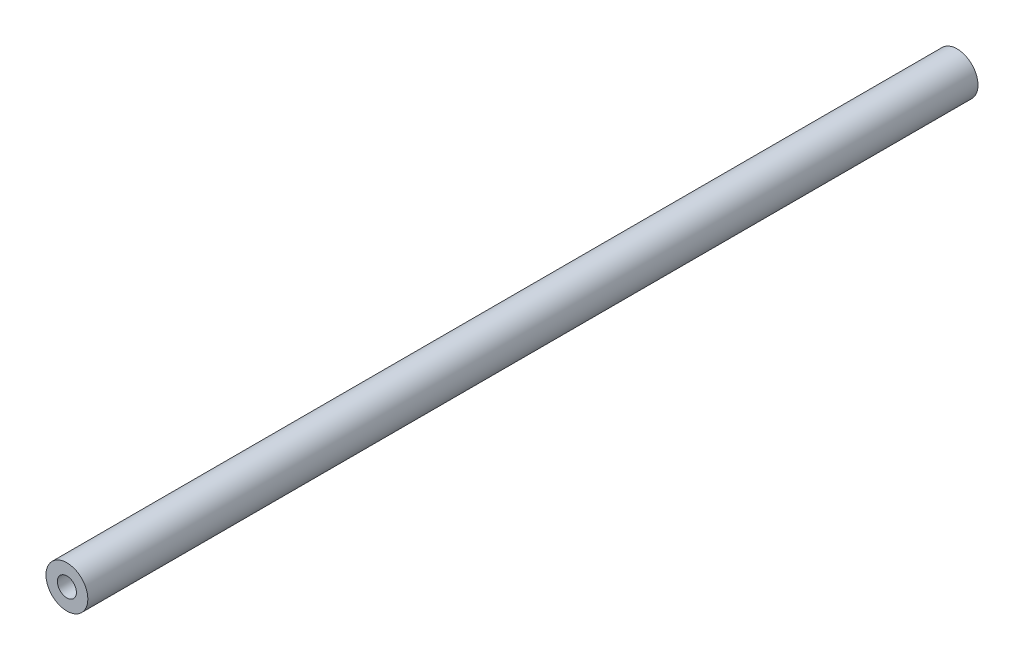
ISO-10303-21;
HEADER;
FILE_DESCRIPTION(('STEP AP214'),'2;1');
FILE_NAME('part.step','',(''),(''),'','','');
FILE_SCHEMA(('AUTOMOTIVE_DESIGN { 1 0 10303 214 1 1 1 1 }'));
ENDSEC;
DATA;
#1=APPLICATION_CONTEXT('core data for automotive mechanical design processes');
#2=APPLICATION_PROTOCOL_DEFINITION('international standard','automotive_design',2000,#1);
#3=PRODUCT_CONTEXT('',#1,'mechanical');
#4=PRODUCT('Part','Part','',(#3));
#5=PRODUCT_RELATED_PRODUCT_CATEGORY('part','',(#4));
#6=PRODUCT_DEFINITION_FORMATION('','',#4);
#7=PRODUCT_DEFINITION_CONTEXT('part definition',#1,'design');
#8=PRODUCT_DEFINITION('design','',#6,#7);
#9=PRODUCT_DEFINITION_SHAPE('','',#8);
#10=(LENGTH_UNIT() NAMED_UNIT(*) SI_UNIT(.MILLI.,.METRE.));
#11=(NAMED_UNIT(*) PLANE_ANGLE_UNIT() SI_UNIT($,.RADIAN.));
#12=(NAMED_UNIT(*) SI_UNIT($,.STERADIAN.) SOLID_ANGLE_UNIT());
#13=UNCERTAINTY_MEASURE_WITH_UNIT(LENGTH_MEASURE(1.E-05),#10,'distance_accuracy_value','');
#14=(GEOMETRIC_REPRESENTATION_CONTEXT(3) GLOBAL_UNCERTAINTY_ASSIGNED_CONTEXT((#13)) GLOBAL_UNIT_ASSIGNED_CONTEXT((#10,
#11,#12)) REPRESENTATION_CONTEXT('',''));
#15=CARTESIAN_POINT('',(0.,0.,0.));
#16=DIRECTION('',(0.,0.,1.));
#17=DIRECTION('',(1.,0.,0.));
#18=AXIS2_PLACEMENT_3D('',#15,#16,#17);
#19=CARTESIAN_POINT('',(0.,0.,116.92));
#20=DIRECTION('',(0.,0.,1.));
#21=DIRECTION('',(1.,0.,0.));
#22=AXIS2_PLACEMENT_3D('',#19,#20,#21);
#23=PLANE('',#22);
#24=CARTESIAN_POINT('',(0.,0.,116.92));
#25=DIRECTION('',(0.,0.,1.));
#26=DIRECTION('',(1.,0.,0.));
#27=AXIS2_PLACEMENT_3D('',#24,#25,#26);
#28=CIRCLE('',#27,2.75);
#29=CARTESIAN_POINT('',(2.75,0.,116.92));
#30=VERTEX_POINT('',#29);
#31=EDGE_CURVE('E10',#30,#30,#28,.T.);
#32=ORIENTED_EDGE('',*,*,#31,.T.);
#33=EDGE_LOOP('',(#32));
#34=FACE_BOUND('',#33,.T.);
#35=CARTESIAN_POINT('',(0.,0.,116.92));
#36=DIRECTION('',(0.,0.,1.));
#37=DIRECTION('',(1.,0.,0.));
#38=AXIS2_PLACEMENT_3D('',#35,#36,#37);
#39=CIRCLE('',#38,1.25);
#40=CARTESIAN_POINT('',(1.25,0.,116.92));
#41=VERTEX_POINT('',#40);
#42=EDGE_CURVE('E45',#41,#41,#39,.T.);
#43=ORIENTED_EDGE('',*,*,#42,.F.);
#44=EDGE_LOOP('',(#43));
#45=FACE_BOUND('',#44,.T.);
#46=ADVANCED_FACE('F34',(#34,#45),#23,.T.);
#47=CARTESIAN_POINT('',(0.,0.,0.));
#48=DIRECTION('',(0.,0.,1.));
#49=DIRECTION('',(1.,0.,0.));
#50=AXIS2_PLACEMENT_3D('',#47,#48,#49);
#51=PLANE('',#50);
#52=CARTESIAN_POINT('',(0.,0.,0.));
#53=DIRECTION('',(0.,0.,1.));
#54=DIRECTION('',(1.,0.,0.));
#55=AXIS2_PLACEMENT_3D('',#52,#53,#54);
#56=CIRCLE('',#55,2.75);
#57=CARTESIAN_POINT('',(2.75,0.,0.));
#58=VERTEX_POINT('',#57);
#59=EDGE_CURVE('E38',#58,#58,#56,.T.);
#60=ORIENTED_EDGE('',*,*,#59,.F.);
#61=EDGE_LOOP('',(#60));
#62=FACE_BOUND('',#61,.T.);
#63=CARTESIAN_POINT('',(0.,0.,0.));
#64=DIRECTION('',(0.,0.,1.));
#65=DIRECTION('',(1.,0.,0.));
#66=AXIS2_PLACEMENT_3D('',#63,#64,#65);
#67=CIRCLE('',#66,1.25);
#68=CARTESIAN_POINT('',(1.25,0.,0.));
#69=VERTEX_POINT('',#68);
#70=EDGE_CURVE('E47',#69,#69,#67,.T.);
#71=ORIENTED_EDGE('',*,*,#70,.T.);
#72=EDGE_LOOP('',(#71));
#73=FACE_BOUND('',#72,.T.);
#74=ADVANCED_FACE('F57',(#62,#73),#51,.F.);
#75=CARTESIAN_POINT('',(0.,0.,116.92));
#76=DIRECTION('',(0.,0.,-1.));
#77=DIRECTION('',(-1.,0.,0.));
#78=AXIS2_PLACEMENT_3D('',#75,#76,#77);
#79=CYLINDRICAL_SURFACE('',#78,2.75);
#80=ORIENTED_EDGE('',*,*,#31,.F.);
#81=EDGE_LOOP('',(#80));
#82=FACE_BOUND('',#81,.T.);
#83=ORIENTED_EDGE('',*,*,#59,.T.);
#84=EDGE_LOOP('',(#83));
#85=FACE_BOUND('',#84,.T.);
#86=ADVANCED_FACE('F36',(#82,#85),#79,.T.);
#87=CARTESIAN_POINT('',(0.,0.,116.92));
#88=DIRECTION('',(0.,0.,-1.));
#89=DIRECTION('',(-1.,0.,0.));
#90=AXIS2_PLACEMENT_3D('',#87,#88,#89);
#91=CYLINDRICAL_SURFACE('',#90,1.25);
#92=ORIENTED_EDGE('',*,*,#42,.T.);
#93=EDGE_LOOP('',(#92));
#94=FACE_BOUND('',#93,.T.);
#95=ORIENTED_EDGE('',*,*,#70,.F.);
#96=EDGE_LOOP('',(#95));
#97=FACE_BOUND('',#96,.T.);
#98=ADVANCED_FACE('F53',(#94,#97),#91,.F.);
#99=CLOSED_SHELL('',(#46,#74,#86,#98));
#100=MANIFOLD_SOLID_BREP('B2',#99);
#101=ADVANCED_BREP_SHAPE_REPRESENTATION('',(#18,#100),#14);
#102=SHAPE_DEFINITION_REPRESENTATION(#9,#101);
ENDSEC;
END-ISO-10303-21;
